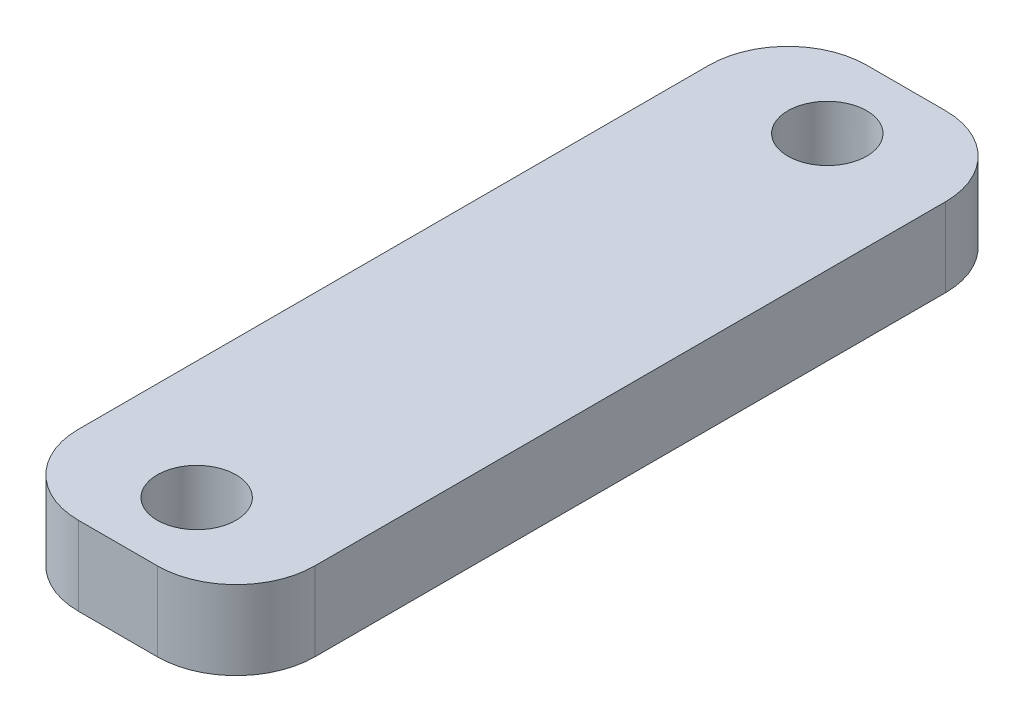
ISO-10303-21;
HEADER;
FILE_DESCRIPTION(('STEP AP214'),'2;1');
FILE_NAME('part.step','',(''),(''),'','','');
FILE_SCHEMA(('AUTOMOTIVE_DESIGN { 1 0 10303 214 1 1 1 1 }'));
ENDSEC;
DATA;
#1=APPLICATION_CONTEXT('core data for automotive mechanical design processes');
#2=APPLICATION_PROTOCOL_DEFINITION('international standard','automotive_design',2000,#1);
#3=PRODUCT_CONTEXT('',#1,'mechanical');
#4=PRODUCT('Part','Part','',(#3));
#5=PRODUCT_RELATED_PRODUCT_CATEGORY('part','',(#4));
#6=PRODUCT_DEFINITION_FORMATION('','',#4);
#7=PRODUCT_DEFINITION_CONTEXT('part definition',#1,'design');
#8=PRODUCT_DEFINITION('design','',#6,#7);
#9=PRODUCT_DEFINITION_SHAPE('','',#8);
#10=(LENGTH_UNIT() NAMED_UNIT(*) SI_UNIT(.MILLI.,.METRE.));
#11=(NAMED_UNIT(*) PLANE_ANGLE_UNIT() SI_UNIT($,.RADIAN.));
#12=(NAMED_UNIT(*) SI_UNIT($,.STERADIAN.) SOLID_ANGLE_UNIT());
#13=UNCERTAINTY_MEASURE_WITH_UNIT(LENGTH_MEASURE(1.E-05),#10,'distance_accuracy_value','');
#14=(GEOMETRIC_REPRESENTATION_CONTEXT(3) GLOBAL_UNCERTAINTY_ASSIGNED_CONTEXT((#13)) GLOBAL_UNIT_ASSIGNED_CONTEXT((#10,
#11,#12)) REPRESENTATION_CONTEXT('',''));
#15=CARTESIAN_POINT('',(0.,0.,0.));
#16=DIRECTION('',(0.,0.,1.));
#17=DIRECTION('',(1.,0.,0.));
#18=AXIS2_PLACEMENT_3D('',#15,#16,#17);
#19=CARTESIAN_POINT('',(15.,10.,50.));
#20=DIRECTION('',(-1.,0.,0.));
#21=DIRECTION('',(0.,0.,1.));
#22=AXIS2_PLACEMENT_3D('',#19,#20,#21);
#23=PLANE('',#22);
#24=DIRECTION('',(0.,0.,-1.));
#25=VECTOR('',#24,1.);
#26=CARTESIAN_POINT('',(15.,0.,50.));
#27=LINE('',#26,#25);
#28=CARTESIAN_POINT('',(15.,0.,40.));
#29=VERTEX_POINT('',#28);
#30=CARTESIAN_POINT('',(15.,0.,-40.));
#31=VERTEX_POINT('',#30);
#32=EDGE_CURVE('E173',#29,#31,#27,.T.);
#33=ORIENTED_EDGE('',*,*,#32,.T.);
#34=DIRECTION('',(0.,-1.,0.));
#35=VECTOR('',#34,1.);
#36=CARTESIAN_POINT('',(15.,10.,-40.));
#37=LINE('',#36,#35);
#38=CARTESIAN_POINT('',(15.,10.,-40.));
#39=VERTEX_POINT('',#38);
#40=EDGE_CURVE('E61',#31,#39,#37,.F.);
#41=ORIENTED_EDGE('',*,*,#40,.T.);
#42=DIRECTION('',(0.,0.,-1.));
#43=VECTOR('',#42,1.);
#44=CARTESIAN_POINT('',(15.,10.,50.));
#45=LINE('',#44,#43);
#46=CARTESIAN_POINT('',(15.,10.,40.));
#47=VERTEX_POINT('',#46);
#48=EDGE_CURVE('E132',#47,#39,#45,.T.);
#49=ORIENTED_EDGE('',*,*,#48,.F.);
#50=DIRECTION('',(0.,-1.,0.));
#51=VECTOR('',#50,1.);
#52=CARTESIAN_POINT('',(15.,10.,40.));
#53=LINE('',#52,#51);
#54=EDGE_CURVE('E148',#47,#29,#53,.T.);
#55=ORIENTED_EDGE('',*,*,#54,.T.);
#56=EDGE_LOOP('',(#33,#41,#49,#55));
#57=FACE_BOUND('',#56,.T.);
#58=ADVANCED_FACE('F38',(#57),#23,.F.);
#59=CARTESIAN_POINT('',(-15.,10.,-50.));
#60=DIRECTION('',(0.,0.,1.));
#61=DIRECTION('',(1.,0.,0.));
#62=AXIS2_PLACEMENT_3D('',#59,#60,#61);
#63=PLANE('',#62);
#64=DIRECTION('',(-1.,0.,0.));
#65=VECTOR('',#64,1.);
#66=CARTESIAN_POINT('',(-15.,10.,-50.));
#67=LINE('',#66,#65);
#68=CARTESIAN_POINT('',(4.99999999999999,10.,-50.));
#69=VERTEX_POINT('',#68);
#70=CARTESIAN_POINT('',(-5.,10.,-50.));
#71=VERTEX_POINT('',#70);
#72=EDGE_CURVE('E135',#69,#71,#67,.T.);
#73=ORIENTED_EDGE('',*,*,#72,.F.);
#74=DIRECTION('',(0.,-1.,0.));
#75=VECTOR('',#74,1.);
#76=CARTESIAN_POINT('',(4.99999999999999,10.,-50.));
#77=LINE('',#76,#75);
#78=CARTESIAN_POINT('',(4.99999999999999,0.,-50.));
#79=VERTEX_POINT('',#78);
#80=EDGE_CURVE('E153',#69,#79,#77,.T.);
#81=ORIENTED_EDGE('',*,*,#80,.T.);
#82=DIRECTION('',(-1.,0.,0.));
#83=VECTOR('',#82,1.);
#84=CARTESIAN_POINT('',(-15.,0.,-50.));
#85=LINE('',#84,#83);
#86=CARTESIAN_POINT('',(-5.,0.,-50.));
#87=VERTEX_POINT('',#86);
#88=EDGE_CURVE('E137',#79,#87,#85,.T.);
#89=ORIENTED_EDGE('',*,*,#88,.T.);
#90=DIRECTION('',(0.,-1.,0.));
#91=VECTOR('',#90,1.);
#92=CARTESIAN_POINT('',(-5.,10.,-50.));
#93=LINE('',#92,#91);
#94=EDGE_CURVE('E151',#87,#71,#93,.F.);
#95=ORIENTED_EDGE('',*,*,#94,.T.);
#96=EDGE_LOOP('',(#73,#81,#89,#95));
#97=FACE_BOUND('',#96,.T.);
#98=ADVANCED_FACE('F167',(#97),#63,.F.);
#99=CARTESIAN_POINT('',(-15.,10.,50.));
#100=DIRECTION('',(1.,0.,0.));
#101=DIRECTION('',(0.,0.,-1.));
#102=AXIS2_PLACEMENT_3D('',#99,#100,#101);
#103=PLANE('',#102);
#104=DIRECTION('',(0.,0.,1.));
#105=VECTOR('',#104,1.);
#106=CARTESIAN_POINT('',(-15.,10.,50.));
#107=LINE('',#106,#105);
#108=CARTESIAN_POINT('',(-15.,10.,-40.));
#109=VERTEX_POINT('',#108);
#110=CARTESIAN_POINT('',(-15.,10.,40.));
#111=VERTEX_POINT('',#110);
#112=EDGE_CURVE('E170',#109,#111,#107,.T.);
#113=ORIENTED_EDGE('',*,*,#112,.F.);
#114=DIRECTION('',(0.,-1.,0.));
#115=VECTOR('',#114,1.);
#116=CARTESIAN_POINT('',(-15.,10.,-40.));
#117=LINE('',#116,#115);
#118=CARTESIAN_POINT('',(-15.,0.,-40.));
#119=VERTEX_POINT('',#118);
#120=EDGE_CURVE('E11',#109,#119,#117,.T.);
#121=ORIENTED_EDGE('',*,*,#120,.T.);
#122=DIRECTION('',(0.,0.,1.));
#123=VECTOR('',#122,1.);
#124=CARTESIAN_POINT('',(-15.,0.,50.));
#125=LINE('',#124,#123);
#126=CARTESIAN_POINT('',(-15.,0.,40.));
#127=VERTEX_POINT('',#126);
#128=EDGE_CURVE('E133',#119,#127,#125,.T.);
#129=ORIENTED_EDGE('',*,*,#128,.T.);
#130=DIRECTION('',(0.,-1.,0.));
#131=VECTOR('',#130,1.);
#132=CARTESIAN_POINT('',(-15.,10.,40.));
#133=LINE('',#132,#131);
#134=EDGE_CURVE('E113',#127,#111,#133,.F.);
#135=ORIENTED_EDGE('',*,*,#134,.T.);
#136=EDGE_LOOP('',(#113,#121,#129,#135));
#137=FACE_BOUND('',#136,.T.);
#138=ADVANCED_FACE('F217',(#137),#103,.F.);
#139=CARTESIAN_POINT('',(-15.,10.,50.));
#140=DIRECTION('',(0.,0.,-1.));
#141=DIRECTION('',(-1.,0.,0.));
#142=AXIS2_PLACEMENT_3D('',#139,#140,#141);
#143=PLANE('',#142);
#144=DIRECTION('',(1.,0.,0.));
#145=VECTOR('',#144,1.);
#146=CARTESIAN_POINT('',(-15.,10.,50.));
#147=LINE('',#146,#145);
#148=CARTESIAN_POINT('',(-5.,10.,50.));
#149=VERTEX_POINT('',#148);
#150=CARTESIAN_POINT('',(4.99999999999999,10.,50.));
#151=VERTEX_POINT('',#150);
#152=EDGE_CURVE('E126',#149,#151,#147,.T.);
#153=ORIENTED_EDGE('',*,*,#152,.F.);
#154=DIRECTION('',(0.,-1.,0.));
#155=VECTOR('',#154,1.);
#156=CARTESIAN_POINT('',(-5.,10.,50.));
#157=LINE('',#156,#155);
#158=CARTESIAN_POINT('',(-5.,0.,50.));
#159=VERTEX_POINT('',#158);
#160=EDGE_CURVE('E111',#149,#159,#157,.T.);
#161=ORIENTED_EDGE('',*,*,#160,.T.);
#162=DIRECTION('',(1.,0.,0.));
#163=VECTOR('',#162,1.);
#164=CARTESIAN_POINT('',(-15.,0.,50.));
#165=LINE('',#164,#163);
#166=CARTESIAN_POINT('',(4.99999999999999,0.,50.));
#167=VERTEX_POINT('',#166);
#168=EDGE_CURVE('E123',#159,#167,#165,.T.);
#169=ORIENTED_EDGE('',*,*,#168,.T.);
#170=DIRECTION('',(0.,-1.,0.));
#171=VECTOR('',#170,1.);
#172=CARTESIAN_POINT('',(4.99999999999999,10.,50.));
#173=LINE('',#172,#171);
#174=EDGE_CURVE('E127',#167,#151,#173,.F.);
#175=ORIENTED_EDGE('',*,*,#174,.T.);
#176=EDGE_LOOP('',(#153,#161,#169,#175));
#177=FACE_BOUND('',#176,.T.);
#178=ADVANCED_FACE('F122',(#177),#143,.F.);
#179=CARTESIAN_POINT('',(0.,10.,0.));
#180=DIRECTION('',(0.,-1.,0.));
#181=DIRECTION('',(0.,0.,-1.));
#182=AXIS2_PLACEMENT_3D('',#179,#180,#181);
#183=PLANE('',#182);
#184=CARTESIAN_POINT('',(0.,10.,40.));
#185=DIRECTION('',(0.,1.,0.));
#186=DIRECTION('',(0.,0.,1.));
#187=AXIS2_PLACEMENT_3D('',#184,#185,#186);
#188=CIRCLE('',#187,5.);
#189=CARTESIAN_POINT('',(0.,10.,45.));
#190=VERTEX_POINT('',#189);
#191=EDGE_CURVE('E188',#190,#190,#188,.T.);
#192=ORIENTED_EDGE('',*,*,#191,.F.);
#193=EDGE_LOOP('',(#192));
#194=FACE_BOUND('',#193,.T.);
#195=CARTESIAN_POINT('',(0.,10.,-40.));
#196=DIRECTION('',(0.,1.,0.));
#197=DIRECTION('',(0.,0.,1.));
#198=AXIS2_PLACEMENT_3D('',#195,#196,#197);
#199=CIRCLE('',#198,5.);
#200=CARTESIAN_POINT('',(0.,10.,-35.));
#201=VERTEX_POINT('',#200);
#202=EDGE_CURVE('E178',#201,#201,#199,.T.);
#203=ORIENTED_EDGE('',*,*,#202,.F.);
#204=EDGE_LOOP('',(#203));
#205=FACE_BOUND('',#204,.T.);
#206=ORIENTED_EDGE('',*,*,#48,.T.);
#207=CARTESIAN_POINT('',(4.99999999999999,10.,-40.));
#208=DIRECTION('',(0.,-1.,0.));
#209=DIRECTION('',(0.,0.,-1.));
#210=AXIS2_PLACEMENT_3D('',#207,#208,#209);
#211=CIRCLE('',#210,10.);
#212=EDGE_CURVE('E46',#39,#69,#211,.F.);
#213=ORIENTED_EDGE('',*,*,#212,.T.);
#214=ORIENTED_EDGE('',*,*,#72,.T.);
#215=CARTESIAN_POINT('',(-5.,10.,-40.));
#216=DIRECTION('',(0.,-1.,0.));
#217=DIRECTION('',(0.,0.,-1.));
#218=AXIS2_PLACEMENT_3D('',#215,#216,#217);
#219=CIRCLE('',#218,10.);
#220=EDGE_CURVE('E53',#71,#109,#219,.F.);
#221=ORIENTED_EDGE('',*,*,#220,.T.);
#222=ORIENTED_EDGE('',*,*,#112,.T.);
#223=CARTESIAN_POINT('',(-5.,10.,40.));
#224=DIRECTION('',(0.,-1.,0.));
#225=DIRECTION('',(0.,0.,-1.));
#226=AXIS2_PLACEMENT_3D('',#223,#224,#225);
#227=CIRCLE('',#226,10.);
#228=EDGE_CURVE('E146',#111,#149,#227,.F.);
#229=ORIENTED_EDGE('',*,*,#228,.T.);
#230=ORIENTED_EDGE('',*,*,#152,.T.);
#231=CARTESIAN_POINT('',(5.,10.,40.));
#232=DIRECTION('',(0.,-1.,0.));
#233=DIRECTION('',(0.,0.,-1.));
#234=AXIS2_PLACEMENT_3D('',#231,#232,#233);
#235=CIRCLE('',#234,10.);
#236=EDGE_CURVE('E144',#151,#47,#235,.F.);
#237=ORIENTED_EDGE('',*,*,#236,.T.);
#238=EDGE_LOOP('',(#206,#213,#214,#221,#222,#229,#230,#237));
#239=FACE_BOUND('',#238,.T.);
#240=ADVANCED_FACE('F163',(#194,#205,#239),#183,.F.);
#241=CARTESIAN_POINT('',(0.,0.,0.));
#242=DIRECTION('',(0.,-1.,0.));
#243=DIRECTION('',(0.,0.,-1.));
#244=AXIS2_PLACEMENT_3D('',#241,#242,#243);
#245=PLANE('',#244);
#246=CARTESIAN_POINT('',(0.,0.,40.));
#247=DIRECTION('',(0.,-1.,0.));
#248=DIRECTION('',(0.,0.,-1.));
#249=AXIS2_PLACEMENT_3D('',#246,#247,#248);
#250=CIRCLE('',#249,5.);
#251=CARTESIAN_POINT('',(0.,0.,35.));
#252=VERTEX_POINT('',#251);
#253=EDGE_CURVE('E185',#252,#252,#250,.F.);
#254=ORIENTED_EDGE('',*,*,#253,.T.);
#255=EDGE_LOOP('',(#254));
#256=FACE_BOUND('',#255,.T.);
#257=CARTESIAN_POINT('',(0.,0.,-40.));
#258=DIRECTION('',(0.,-1.,0.));
#259=DIRECTION('',(0.,0.,-1.));
#260=AXIS2_PLACEMENT_3D('',#257,#258,#259);
#261=CIRCLE('',#260,5.);
#262=CARTESIAN_POINT('',(0.,0.,-45.));
#263=VERTEX_POINT('',#262);
#264=EDGE_CURVE('E175',#263,#263,#261,.F.);
#265=ORIENTED_EDGE('',*,*,#264,.T.);
#266=EDGE_LOOP('',(#265));
#267=FACE_BOUND('',#266,.T.);
#268=ORIENTED_EDGE('',*,*,#88,.F.);
#269=CARTESIAN_POINT('',(4.99999999999999,0.,-40.));
#270=DIRECTION('',(0.,-1.,0.));
#271=DIRECTION('',(0.,0.,-1.));
#272=AXIS2_PLACEMENT_3D('',#269,#270,#271);
#273=CIRCLE('',#272,10.);
#274=EDGE_CURVE('E158',#79,#31,#273,.T.);
#275=ORIENTED_EDGE('',*,*,#274,.T.);
#276=ORIENTED_EDGE('',*,*,#32,.F.);
#277=CARTESIAN_POINT('',(5.,0.,40.));
#278=DIRECTION('',(0.,-1.,0.));
#279=DIRECTION('',(0.,0.,-1.));
#280=AXIS2_PLACEMENT_3D('',#277,#278,#279);
#281=CIRCLE('',#280,10.);
#282=EDGE_CURVE('E117',#29,#167,#281,.T.);
#283=ORIENTED_EDGE('',*,*,#282,.T.);
#284=ORIENTED_EDGE('',*,*,#168,.F.);
#285=CARTESIAN_POINT('',(-5.,0.,40.));
#286=DIRECTION('',(0.,-1.,0.));
#287=DIRECTION('',(0.,0.,-1.));
#288=AXIS2_PLACEMENT_3D('',#285,#286,#287);
#289=CIRCLE('',#288,10.);
#290=EDGE_CURVE('E107',#159,#127,#289,.T.);
#291=ORIENTED_EDGE('',*,*,#290,.T.);
#292=ORIENTED_EDGE('',*,*,#128,.F.);
#293=CARTESIAN_POINT('',(-5.,0.,-40.));
#294=DIRECTION('',(0.,-1.,0.));
#295=DIRECTION('',(0.,0.,-1.));
#296=AXIS2_PLACEMENT_3D('',#293,#294,#295);
#297=CIRCLE('',#296,10.);
#298=EDGE_CURVE('E156',#119,#87,#297,.T.);
#299=ORIENTED_EDGE('',*,*,#298,.T.);
#300=EDGE_LOOP('',(#268,#275,#276,#283,#284,#291,#292,#299));
#301=FACE_BOUND('',#300,.T.);
#302=ADVANCED_FACE('F130',(#256,#267,#301),#245,.T.);
#303=CARTESIAN_POINT('',(0.,-14.1421356237309,-40.));
#304=DIRECTION('',(0.,1.,0.));
#305=DIRECTION('',(0.,0.,1.));
#306=AXIS2_PLACEMENT_3D('',#303,#304,#305);
#307=CYLINDRICAL_SURFACE('',#306,5.);
#308=ORIENTED_EDGE('',*,*,#202,.T.);
#309=EDGE_LOOP('',(#308));
#310=FACE_BOUND('',#309,.T.);
#311=ORIENTED_EDGE('',*,*,#264,.F.);
#312=EDGE_LOOP('',(#311));
#313=FACE_BOUND('',#312,.T.);
#314=ADVANCED_FACE('F200',(#310,#313),#307,.F.);
#315=CARTESIAN_POINT('',(0.,-14.1421356237309,40.));
#316=DIRECTION('',(0.,1.,0.));
#317=DIRECTION('',(0.,0.,1.));
#318=AXIS2_PLACEMENT_3D('',#315,#316,#317);
#319=CYLINDRICAL_SURFACE('',#318,5.);
#320=ORIENTED_EDGE('',*,*,#191,.T.);
#321=EDGE_LOOP('',(#320));
#322=FACE_BOUND('',#321,.T.);
#323=ORIENTED_EDGE('',*,*,#253,.F.);
#324=EDGE_LOOP('',(#323));
#325=FACE_BOUND('',#324,.T.);
#326=ADVANCED_FACE('F192',(#322,#325),#319,.F.);
#327=CARTESIAN_POINT('',(-5.,10.,40.));
#328=DIRECTION('',(0.,-1.,0.));
#329=DIRECTION('',(0.,0.,-1.));
#330=AXIS2_PLACEMENT_3D('',#327,#328,#329);
#331=CYLINDRICAL_SURFACE('',#330,10.);
#332=ORIENTED_EDGE('',*,*,#228,.F.);
#333=ORIENTED_EDGE('',*,*,#134,.F.);
#334=ORIENTED_EDGE('',*,*,#290,.F.);
#335=ORIENTED_EDGE('',*,*,#160,.F.);
#336=EDGE_LOOP('',(#332,#333,#334,#335));
#337=FACE_BOUND('',#336,.T.);
#338=ADVANCED_FACE('F110',(#337),#331,.T.);
#339=CARTESIAN_POINT('',(5.,10.,40.));
#340=DIRECTION('',(0.,-1.,0.));
#341=DIRECTION('',(0.,0.,-1.));
#342=AXIS2_PLACEMENT_3D('',#339,#340,#341);
#343=CYLINDRICAL_SURFACE('',#342,10.);
#344=ORIENTED_EDGE('',*,*,#236,.F.);
#345=ORIENTED_EDGE('',*,*,#174,.F.);
#346=ORIENTED_EDGE('',*,*,#282,.F.);
#347=ORIENTED_EDGE('',*,*,#54,.F.);
#348=EDGE_LOOP('',(#344,#345,#346,#347));
#349=FACE_BOUND('',#348,.T.);
#350=ADVANCED_FACE('F223',(#349),#343,.T.);
#351=CARTESIAN_POINT('',(4.99999999999999,10.,-40.));
#352=DIRECTION('',(0.,-1.,0.));
#353=DIRECTION('',(0.,0.,-1.));
#354=AXIS2_PLACEMENT_3D('',#351,#352,#353);
#355=CYLINDRICAL_SURFACE('',#354,10.);
#356=ORIENTED_EDGE('',*,*,#212,.F.);
#357=ORIENTED_EDGE('',*,*,#40,.F.);
#358=ORIENTED_EDGE('',*,*,#274,.F.);
#359=ORIENTED_EDGE('',*,*,#80,.F.);
#360=EDGE_LOOP('',(#356,#357,#358,#359));
#361=FACE_BOUND('',#360,.T.);
#362=ADVANCED_FACE('F172',(#361),#355,.T.);
#363=CARTESIAN_POINT('',(-5.,10.,-40.));
#364=DIRECTION('',(0.,-1.,0.));
#365=DIRECTION('',(0.,0.,-1.));
#366=AXIS2_PLACEMENT_3D('',#363,#364,#365);
#367=CYLINDRICAL_SURFACE('',#366,10.);
#368=ORIENTED_EDGE('',*,*,#220,.F.);
#369=ORIENTED_EDGE('',*,*,#94,.F.);
#370=ORIENTED_EDGE('',*,*,#298,.F.);
#371=ORIENTED_EDGE('',*,*,#120,.F.);
#372=EDGE_LOOP('',(#368,#369,#370,#371));
#373=FACE_BOUND('',#372,.T.);
#374=ADVANCED_FACE('F40',(#373),#367,.T.);
#375=CLOSED_SHELL('',(#58,#98,#138,#178,#240,#302,#314,#326,#338,#350,#362,#374));
#376=MANIFOLD_SOLID_BREP('B2',#375);
#377=ADVANCED_BREP_SHAPE_REPRESENTATION('',(#18,#376),#14);
#378=SHAPE_DEFINITION_REPRESENTATION(#9,#377);
ENDSEC;
END-ISO-10303-21;
